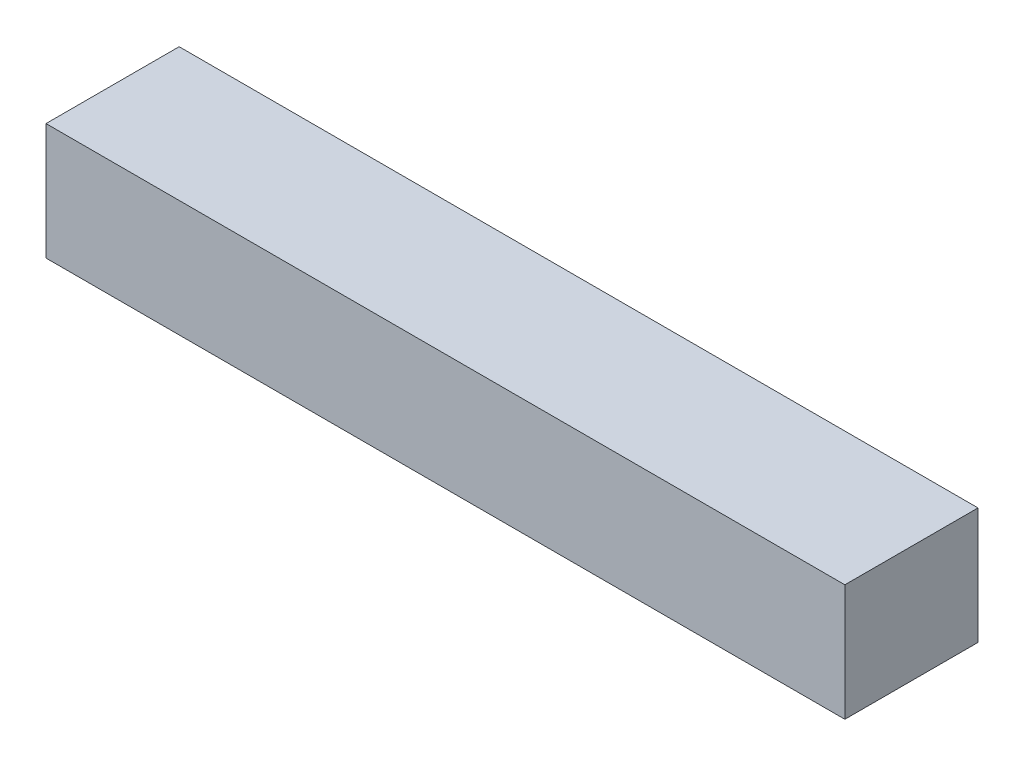
ISO-10303-21;
HEADER;
FILE_DESCRIPTION(('STEP AP214'),'2;1');
FILE_NAME('part.step','',(''),(''),'','','');
FILE_SCHEMA(('AUTOMOTIVE_DESIGN { 1 0 10303 214 1 1 1 1 }'));
ENDSEC;
DATA;
#1=APPLICATION_CONTEXT('core data for automotive mechanical design processes');
#2=APPLICATION_PROTOCOL_DEFINITION('international standard','automotive_design',2000,#1);
#3=PRODUCT_CONTEXT('',#1,'mechanical');
#4=PRODUCT('Part','Part','',(#3));
#5=PRODUCT_RELATED_PRODUCT_CATEGORY('part','',(#4));
#6=PRODUCT_DEFINITION_FORMATION('','',#4);
#7=PRODUCT_DEFINITION_CONTEXT('part definition',#1,'design');
#8=PRODUCT_DEFINITION('design','',#6,#7);
#9=PRODUCT_DEFINITION_SHAPE('','',#8);
#10=(LENGTH_UNIT() NAMED_UNIT(*) SI_UNIT(.MILLI.,.METRE.));
#11=(NAMED_UNIT(*) PLANE_ANGLE_UNIT() SI_UNIT($,.RADIAN.));
#12=(NAMED_UNIT(*) SI_UNIT($,.STERADIAN.) SOLID_ANGLE_UNIT());
#13=UNCERTAINTY_MEASURE_WITH_UNIT(LENGTH_MEASURE(1.E-05),#10,'distance_accuracy_value','');
#14=(GEOMETRIC_REPRESENTATION_CONTEXT(3) GLOBAL_UNCERTAINTY_ASSIGNED_CONTEXT((#13)) GLOBAL_UNIT_ASSIGNED_CONTEXT((#10,
#11,#12)) REPRESENTATION_CONTEXT('',''));
#15=CARTESIAN_POINT('',(0.,0.,0.));
#16=DIRECTION('',(0.,0.,1.));
#17=DIRECTION('',(1.,0.,0.));
#18=AXIS2_PLACEMENT_3D('',#15,#16,#17);
#19=CARTESIAN_POINT('',(0.,44.45,0.));
#20=DIRECTION('',(1.,0.,0.));
#21=DIRECTION('',(0.,0.,-1.));
#22=AXIS2_PLACEMENT_3D('',#19,#20,#21);
#23=PLANE('',#22);
#24=DIRECTION('',(0.,0.,1.));
#25=VECTOR('',#24,1.);
#26=CARTESIAN_POINT('',(0.,0.,0.));
#27=LINE('',#26,#25);
#28=CARTESIAN_POINT('',(0.,0.,-50.8));
#29=VERTEX_POINT('',#28);
#30=CARTESIAN_POINT('',(0.,0.,0.));
#31=VERTEX_POINT('',#30);
#32=EDGE_CURVE('E106',#29,#31,#27,.T.);
#33=ORIENTED_EDGE('',*,*,#32,.T.);
#34=DIRECTION('',(0.,-1.,0.));
#35=VECTOR('',#34,1.);
#36=CARTESIAN_POINT('',(0.,44.45,0.));
#37=LINE('',#36,#35);
#38=CARTESIAN_POINT('',(0.,44.45,0.));
#39=VERTEX_POINT('',#38);
#40=EDGE_CURVE('E11',#39,#31,#37,.T.);
#41=ORIENTED_EDGE('',*,*,#40,.F.);
#42=DIRECTION('',(0.,0.,1.));
#43=VECTOR('',#42,1.);
#44=CARTESIAN_POINT('',(0.,44.45,0.));
#45=LINE('',#44,#43);
#46=CARTESIAN_POINT('',(0.,44.45,-50.8));
#47=VERTEX_POINT('',#46);
#48=EDGE_CURVE('E94',#47,#39,#45,.T.);
#49=ORIENTED_EDGE('',*,*,#48,.F.);
#50=DIRECTION('',(0.,-1.,0.));
#51=VECTOR('',#50,1.);
#52=CARTESIAN_POINT('',(0.,44.45,-50.8));
#53=LINE('',#52,#51);
#54=EDGE_CURVE('E102',#47,#29,#53,.T.);
#55=ORIENTED_EDGE('',*,*,#54,.T.);
#56=EDGE_LOOP('',(#33,#41,#49,#55));
#57=FACE_BOUND('',#56,.T.);
#58=ADVANCED_FACE('F43',(#57),#23,.F.);
#59=CARTESIAN_POINT('',(0.,44.45,0.));
#60=DIRECTION('',(0.,0.,-1.));
#61=DIRECTION('',(-1.,0.,0.));
#62=AXIS2_PLACEMENT_3D('',#59,#60,#61);
#63=PLANE('',#62);
#64=DIRECTION('',(1.,0.,0.));
#65=VECTOR('',#64,1.);
#66=CARTESIAN_POINT('',(0.,0.,0.));
#67=LINE('',#66,#65);
#68=CARTESIAN_POINT('',(304.8,0.,0.));
#69=VERTEX_POINT('',#68);
#70=EDGE_CURVE('E98',#31,#69,#67,.T.);
#71=ORIENTED_EDGE('',*,*,#70,.T.);
#72=DIRECTION('',(0.,-1.,0.));
#73=VECTOR('',#72,1.);
#74=CARTESIAN_POINT('',(304.8,44.45,0.));
#75=LINE('',#74,#73);
#76=CARTESIAN_POINT('',(304.8,44.45,0.));
#77=VERTEX_POINT('',#76);
#78=EDGE_CURVE('E51',#77,#69,#75,.T.);
#79=ORIENTED_EDGE('',*,*,#78,.F.);
#80=DIRECTION('',(1.,0.,0.));
#81=VECTOR('',#80,1.);
#82=CARTESIAN_POINT('',(0.,44.45,0.));
#83=LINE('',#82,#81);
#84=EDGE_CURVE('E89',#39,#77,#83,.T.);
#85=ORIENTED_EDGE('',*,*,#84,.F.);
#86=ORIENTED_EDGE('',*,*,#40,.T.);
#87=EDGE_LOOP('',(#71,#79,#85,#86));
#88=FACE_BOUND('',#87,.T.);
#89=ADVANCED_FACE('F97',(#88),#63,.F.);
#90=CARTESIAN_POINT('',(304.8,44.45,0.));
#91=DIRECTION('',(-1.,0.,0.));
#92=DIRECTION('',(0.,0.,1.));
#93=AXIS2_PLACEMENT_3D('',#90,#91,#92);
#94=PLANE('',#93);
#95=DIRECTION('',(0.,0.,-1.));
#96=VECTOR('',#95,1.);
#97=CARTESIAN_POINT('',(304.8,0.,0.));
#98=LINE('',#97,#96);
#99=CARTESIAN_POINT('',(304.8,0.,-50.8));
#100=VERTEX_POINT('',#99);
#101=EDGE_CURVE('E76',#69,#100,#98,.T.);
#102=ORIENTED_EDGE('',*,*,#101,.T.);
#103=DIRECTION('',(0.,-1.,0.));
#104=VECTOR('',#103,1.);
#105=CARTESIAN_POINT('',(304.8,44.45,-50.8));
#106=LINE('',#105,#104);
#107=CARTESIAN_POINT('',(304.8,44.45,-50.8));
#108=VERTEX_POINT('',#107);
#109=EDGE_CURVE('E99',#108,#100,#106,.T.);
#110=ORIENTED_EDGE('',*,*,#109,.F.);
#111=DIRECTION('',(0.,0.,-1.));
#112=VECTOR('',#111,1.);
#113=CARTESIAN_POINT('',(304.8,44.45,0.));
#114=LINE('',#113,#112);
#115=EDGE_CURVE('E92',#77,#108,#114,.T.);
#116=ORIENTED_EDGE('',*,*,#115,.F.);
#117=ORIENTED_EDGE('',*,*,#78,.T.);
#118=EDGE_LOOP('',(#102,#110,#116,#117));
#119=FACE_BOUND('',#118,.T.);
#120=ADVANCED_FACE('F100',(#119),#94,.F.);
#121=CARTESIAN_POINT('',(0.,44.45,-50.8));
#122=DIRECTION('',(0.,0.,1.));
#123=DIRECTION('',(1.,0.,0.));
#124=AXIS2_PLACEMENT_3D('',#121,#122,#123);
#125=PLANE('',#124);
#126=DIRECTION('',(-1.,0.,0.));
#127=VECTOR('',#126,1.);
#128=CARTESIAN_POINT('',(0.,0.,-50.8));
#129=LINE('',#128,#127);
#130=EDGE_CURVE('E82',#100,#29,#129,.T.);
#131=ORIENTED_EDGE('',*,*,#130,.T.);
#132=ORIENTED_EDGE('',*,*,#54,.F.);
#133=DIRECTION('',(-1.,0.,0.));
#134=VECTOR('',#133,1.);
#135=CARTESIAN_POINT('',(0.,44.45,-50.8));
#136=LINE('',#135,#134);
#137=EDGE_CURVE('E59',#108,#47,#136,.T.);
#138=ORIENTED_EDGE('',*,*,#137,.F.);
#139=ORIENTED_EDGE('',*,*,#109,.T.);
#140=EDGE_LOOP('',(#131,#132,#138,#139));
#141=FACE_BOUND('',#140,.T.);
#142=ADVANCED_FACE('F113',(#141),#125,.F.);
#143=CARTESIAN_POINT('',(0.,44.45,0.));
#144=DIRECTION('',(0.,-1.,0.));
#145=DIRECTION('',(0.,0.,-1.));
#146=AXIS2_PLACEMENT_3D('',#143,#144,#145);
#147=PLANE('',#146);
#148=ORIENTED_EDGE('',*,*,#48,.T.);
#149=ORIENTED_EDGE('',*,*,#84,.T.);
#150=ORIENTED_EDGE('',*,*,#115,.T.);
#151=ORIENTED_EDGE('',*,*,#137,.T.);
#152=EDGE_LOOP('',(#148,#149,#150,#151));
#153=FACE_BOUND('',#152,.T.);
#154=ADVANCED_FACE('F90',(#153),#147,.F.);
#155=CARTESIAN_POINT('',(0.,0.,0.));
#156=DIRECTION('',(0.,-1.,0.));
#157=DIRECTION('',(0.,0.,-1.));
#158=AXIS2_PLACEMENT_3D('',#155,#156,#157);
#159=PLANE('',#158);
#160=ORIENTED_EDGE('',*,*,#32,.F.);
#161=ORIENTED_EDGE('',*,*,#130,.F.);
#162=ORIENTED_EDGE('',*,*,#101,.F.);
#163=ORIENTED_EDGE('',*,*,#70,.F.);
#164=EDGE_LOOP('',(#160,#161,#162,#163));
#165=FACE_BOUND('',#164,.T.);
#166=ADVANCED_FACE('F116',(#165),#159,.T.);
#167=CLOSED_SHELL('',(#58,#89,#120,#142,#154,#166));
#168=MANIFOLD_SOLID_BREP('B2',#167);
#169=ADVANCED_BREP_SHAPE_REPRESENTATION('',(#18,#168),#14);
#170=SHAPE_DEFINITION_REPRESENTATION(#9,#169);
ENDSEC;
END-ISO-10303-21;
